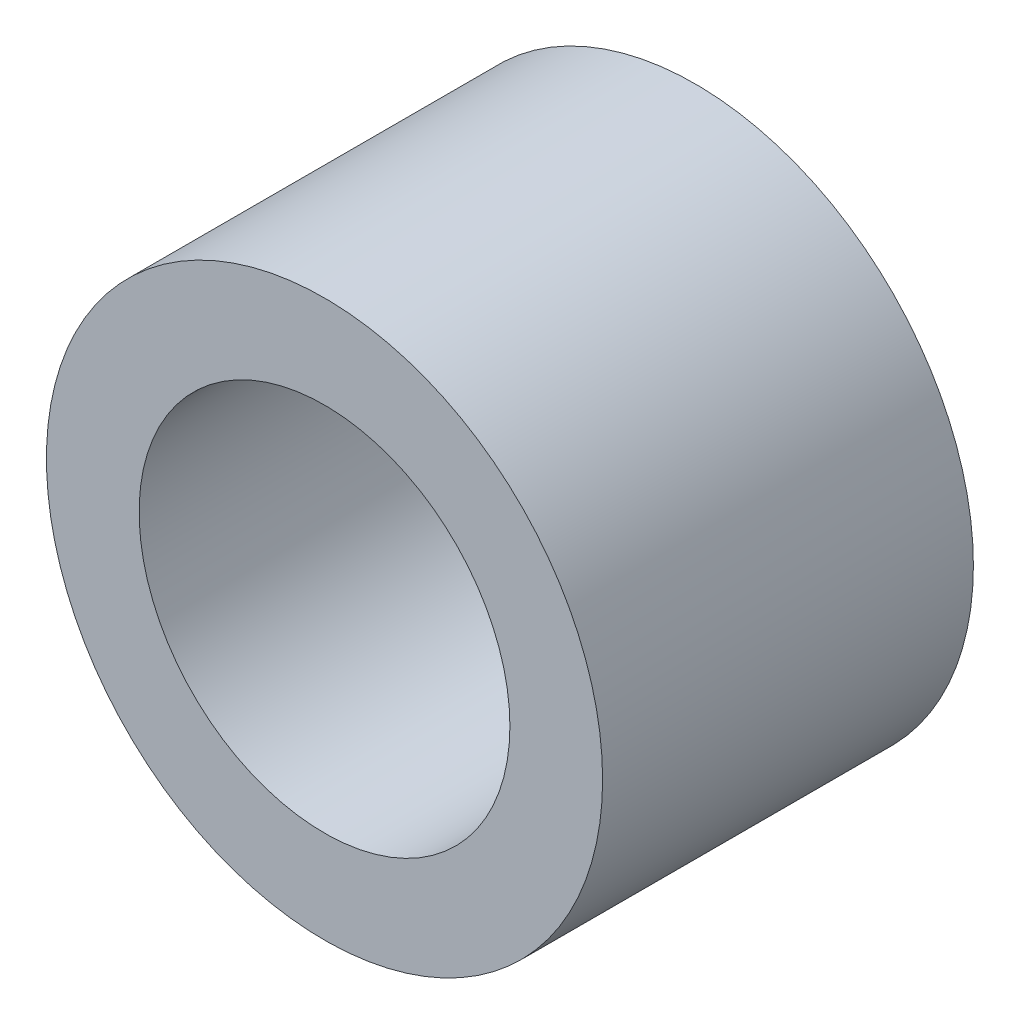
ISO-10303-21;
HEADER;
FILE_DESCRIPTION(('STEP AP214'),'2;1');
FILE_NAME('part.step','',(''),(''),'','','');
FILE_SCHEMA(('AUTOMOTIVE_DESIGN { 1 0 10303 214 1 1 1 1 }'));
ENDSEC;
DATA;
#1=APPLICATION_CONTEXT('core data for automotive mechanical design processes');
#2=APPLICATION_PROTOCOL_DEFINITION('international standard','automotive_design',2000,#1);
#3=PRODUCT_CONTEXT('',#1,'mechanical');
#4=PRODUCT('Part','Part','',(#3));
#5=PRODUCT_RELATED_PRODUCT_CATEGORY('part','',(#4));
#6=PRODUCT_DEFINITION_FORMATION('','',#4);
#7=PRODUCT_DEFINITION_CONTEXT('part definition',#1,'design');
#8=PRODUCT_DEFINITION('design','',#6,#7);
#9=PRODUCT_DEFINITION_SHAPE('','',#8);
#10=(LENGTH_UNIT() NAMED_UNIT(*) SI_UNIT(.MILLI.,.METRE.));
#11=(NAMED_UNIT(*) PLANE_ANGLE_UNIT() SI_UNIT($,.RADIAN.));
#12=(NAMED_UNIT(*) SI_UNIT($,.STERADIAN.) SOLID_ANGLE_UNIT());
#13=UNCERTAINTY_MEASURE_WITH_UNIT(LENGTH_MEASURE(1.E-05),#10,'distance_accuracy_value','');
#14=(GEOMETRIC_REPRESENTATION_CONTEXT(3) GLOBAL_UNCERTAINTY_ASSIGNED_CONTEXT((#13)) GLOBAL_UNIT_ASSIGNED_CONTEXT((#10,
#11,#12)) REPRESENTATION_CONTEXT('',''));
#15=CARTESIAN_POINT('',(0.,0.,0.));
#16=DIRECTION('',(0.,0.,1.));
#17=DIRECTION('',(1.,0.,0.));
#18=AXIS2_PLACEMENT_3D('',#15,#16,#17);
#19=CARTESIAN_POINT('',(0.,0.,6.));
#20=DIRECTION('',(0.,0.,1.));
#21=DIRECTION('',(1.,0.,0.));
#22=AXIS2_PLACEMENT_3D('',#19,#20,#21);
#23=PLANE('',#22);
#24=CARTESIAN_POINT('',(0.,0.,6.));
#25=DIRECTION('',(0.,0.,1.));
#26=DIRECTION('',(1.,0.,0.));
#27=AXIS2_PLACEMENT_3D('',#24,#25,#26);
#28=CIRCLE('',#27,9.);
#29=CARTESIAN_POINT('',(9.00000000000001,0.,6.));
#30=VERTEX_POINT('',#29);
#31=EDGE_CURVE('E10',#30,#30,#28,.T.);
#32=ORIENTED_EDGE('',*,*,#31,.T.);
#33=EDGE_LOOP('',(#32));
#34=FACE_BOUND('',#33,.T.);
#35=CARTESIAN_POINT('',(0.,0.,6.));
#36=DIRECTION('',(0.,0.,1.));
#37=DIRECTION('',(1.,0.,0.));
#38=AXIS2_PLACEMENT_3D('',#35,#36,#37);
#39=CIRCLE('',#38,6.);
#40=CARTESIAN_POINT('',(6.,0.,6.));
#41=VERTEX_POINT('',#40);
#42=EDGE_CURVE('E47',#41,#41,#39,.T.);
#43=ORIENTED_EDGE('',*,*,#42,.F.);
#44=EDGE_LOOP('',(#43));
#45=FACE_BOUND('',#44,.T.);
#46=ADVANCED_FACE('F34',(#34,#45),#23,.T.);
#47=CARTESIAN_POINT('',(0.,0.,-6.));
#48=DIRECTION('',(0.,0.,1.));
#49=DIRECTION('',(1.,0.,0.));
#50=AXIS2_PLACEMENT_3D('',#47,#48,#49);
#51=PLANE('',#50);
#52=CARTESIAN_POINT('',(0.,0.,-6.));
#53=DIRECTION('',(0.,0.,1.));
#54=DIRECTION('',(1.,0.,0.));
#55=AXIS2_PLACEMENT_3D('',#52,#53,#54);
#56=CIRCLE('',#55,9.);
#57=CARTESIAN_POINT('',(9.00000000000001,0.,-6.));
#58=VERTEX_POINT('',#57);
#59=EDGE_CURVE('E39',#58,#58,#56,.T.);
#60=ORIENTED_EDGE('',*,*,#59,.F.);
#61=EDGE_LOOP('',(#60));
#62=FACE_BOUND('',#61,.T.);
#63=CARTESIAN_POINT('',(0.,0.,-6.));
#64=DIRECTION('',(0.,0.,1.));
#65=DIRECTION('',(1.,0.,0.));
#66=AXIS2_PLACEMENT_3D('',#63,#64,#65);
#67=CIRCLE('',#66,6.);
#68=CARTESIAN_POINT('',(6.,0.,-6.));
#69=VERTEX_POINT('',#68);
#70=EDGE_CURVE('E51',#69,#69,#67,.T.);
#71=ORIENTED_EDGE('',*,*,#70,.T.);
#72=EDGE_LOOP('',(#71));
#73=FACE_BOUND('',#72,.T.);
#74=ADVANCED_FACE('F63',(#62,#73),#51,.F.);
#75=CARTESIAN_POINT('',(0.,0.,6.));
#76=DIRECTION('',(0.,0.,-1.));
#77=DIRECTION('',(-1.,0.,0.));
#78=AXIS2_PLACEMENT_3D('',#75,#76,#77);
#79=CYLINDRICAL_SURFACE('',#78,9.);
#80=ORIENTED_EDGE('',*,*,#31,.F.);
#81=EDGE_LOOP('',(#80));
#82=FACE_BOUND('',#81,.T.);
#83=ORIENTED_EDGE('',*,*,#59,.T.);
#84=EDGE_LOOP('',(#83));
#85=FACE_BOUND('',#84,.T.);
#86=ADVANCED_FACE('F40',(#82,#85),#79,.T.);
#87=CARTESIAN_POINT('',(0.,0.,6.));
#88=DIRECTION('',(0.,0.,-1.));
#89=DIRECTION('',(-1.,0.,0.));
#90=AXIS2_PLACEMENT_3D('',#87,#88,#89);
#91=CYLINDRICAL_SURFACE('',#90,6.);
#92=ORIENTED_EDGE('',*,*,#42,.T.);
#93=EDGE_LOOP('',(#92));
#94=FACE_BOUND('',#93,.T.);
#95=ORIENTED_EDGE('',*,*,#70,.F.);
#96=EDGE_LOOP('',(#95));
#97=FACE_BOUND('',#96,.T.);
#98=ADVANCED_FACE('F58',(#94,#97),#91,.F.);
#99=CLOSED_SHELL('',(#46,#74,#86,#98));
#100=MANIFOLD_SOLID_BREP('B2',#99);
#101=ADVANCED_BREP_SHAPE_REPRESENTATION('',(#18,#100),#14);
#102=SHAPE_DEFINITION_REPRESENTATION(#9,#101);
ENDSEC;
END-ISO-10303-21;
